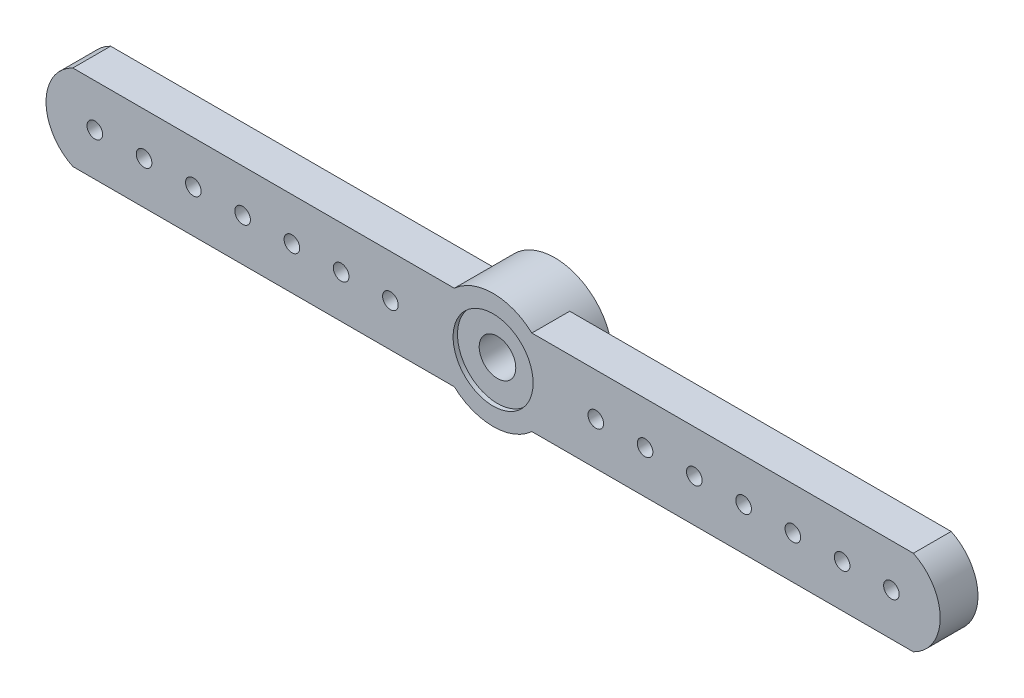
ISO-10303-21;
HEADER;
FILE_DESCRIPTION(('STEP AP214'),'2;1');
FILE_NAME('part.step','',(''),(''),'','','');
FILE_SCHEMA(('AUTOMOTIVE_DESIGN { 1 0 10303 214 1 1 1 1 }'));
ENDSEC;
DATA;
#1=APPLICATION_CONTEXT('core data for automotive mechanical design processes');
#2=APPLICATION_PROTOCOL_DEFINITION('international standard','automotive_design',2000,#1);
#3=PRODUCT_CONTEXT('',#1,'mechanical');
#4=PRODUCT('Part','Part','',(#3));
#5=PRODUCT_RELATED_PRODUCT_CATEGORY('part','',(#4));
#6=PRODUCT_DEFINITION_FORMATION('','',#4);
#7=PRODUCT_DEFINITION_CONTEXT('part definition',#1,'design');
#8=PRODUCT_DEFINITION('design','',#6,#7);
#9=PRODUCT_DEFINITION_SHAPE('','',#8);
#10=(LENGTH_UNIT() NAMED_UNIT(*) SI_UNIT(.MILLI.,.METRE.));
#11=(NAMED_UNIT(*) PLANE_ANGLE_UNIT() SI_UNIT($,.RADIAN.));
#12=(NAMED_UNIT(*) SI_UNIT($,.STERADIAN.) SOLID_ANGLE_UNIT());
#13=UNCERTAINTY_MEASURE_WITH_UNIT(LENGTH_MEASURE(1.E-05),#10,'distance_accuracy_value','');
#14=(GEOMETRIC_REPRESENTATION_CONTEXT(3) GLOBAL_UNCERTAINTY_ASSIGNED_CONTEXT((#13)) GLOBAL_UNIT_ASSIGNED_CONTEXT((#10,
#11,#12)) REPRESENTATION_CONTEXT('',''));
#15=CARTESIAN_POINT('',(0.,0.,0.));
#16=DIRECTION('',(0.,0.,1.));
#17=DIRECTION('',(1.,0.,0.));
#18=AXIS2_PLACEMENT_3D('',#15,#16,#17);
#19=CARTESIAN_POINT('',(0.,0.,0.));
#20=DIRECTION('',(0.,0.,1.));
#21=DIRECTION('',(1.,0.,0.));
#22=AXIS2_PLACEMENT_3D('',#19,#20,#21);
#23=PLANE('',#22);
#24=CARTESIAN_POINT('',(20.7391,0.,0.));
#25=DIRECTION('',(0.,0.,1.));
#26=DIRECTION('',(-1.,0.,0.));
#27=AXIS2_PLACEMENT_3D('',#24,#25,#26);
#28=CIRCLE('',#27,0.406400000000001);
#29=CARTESIAN_POINT('',(20.3327,0.,0.));
#30=VERTEX_POINT('',#29);
#31=EDGE_CURVE('E280',#30,#30,#28,.T.);
#32=ORIENTED_EDGE('',*,*,#31,.T.);
#33=EDGE_LOOP('',(#32));
#34=FACE_BOUND('',#33,.T.);
#35=CARTESIAN_POINT('',(18.1737,0.,0.));
#36=DIRECTION('',(0.,0.,1.));
#37=DIRECTION('',(-1.,0.,0.));
#38=AXIS2_PLACEMENT_3D('',#35,#36,#37);
#39=CIRCLE('',#38,0.406400000000001);
#40=CARTESIAN_POINT('',(17.7673,0.,0.));
#41=VERTEX_POINT('',#40);
#42=EDGE_CURVE('E274',#41,#41,#39,.T.);
#43=ORIENTED_EDGE('',*,*,#42,.T.);
#44=EDGE_LOOP('',(#43));
#45=FACE_BOUND('',#44,.T.);
#46=CARTESIAN_POINT('',(15.6083,0.,0.));
#47=DIRECTION('',(0.,0.,1.));
#48=DIRECTION('',(-1.,0.,0.));
#49=AXIS2_PLACEMENT_3D('',#46,#47,#48);
#50=CIRCLE('',#49,0.406400000000001);
#51=CARTESIAN_POINT('',(15.2019,0.,0.));
#52=VERTEX_POINT('',#51);
#53=EDGE_CURVE('E268',#52,#52,#50,.T.);
#54=ORIENTED_EDGE('',*,*,#53,.T.);
#55=EDGE_LOOP('',(#54));
#56=FACE_BOUND('',#55,.T.);
#57=CARTESIAN_POINT('',(13.0429,0.,0.));
#58=DIRECTION('',(0.,0.,1.));
#59=DIRECTION('',(-1.,0.,0.));
#60=AXIS2_PLACEMENT_3D('',#57,#58,#59);
#61=CIRCLE('',#60,0.406400000000001);
#62=CARTESIAN_POINT('',(12.6365,0.,0.));
#63=VERTEX_POINT('',#62);
#64=EDGE_CURVE('E262',#63,#63,#61,.T.);
#65=ORIENTED_EDGE('',*,*,#64,.T.);
#66=EDGE_LOOP('',(#65));
#67=FACE_BOUND('',#66,.T.);
#68=CARTESIAN_POINT('',(10.4775,0.,0.));
#69=DIRECTION('',(0.,0.,1.));
#70=DIRECTION('',(-1.,0.,0.));
#71=AXIS2_PLACEMENT_3D('',#68,#69,#70);
#72=CIRCLE('',#71,0.406400000000001);
#73=CARTESIAN_POINT('',(10.0711,0.,0.));
#74=VERTEX_POINT('',#73);
#75=EDGE_CURVE('E256',#74,#74,#72,.T.);
#76=ORIENTED_EDGE('',*,*,#75,.T.);
#77=EDGE_LOOP('',(#76));
#78=FACE_BOUND('',#77,.T.);
#79=CARTESIAN_POINT('',(7.9121,0.,0.));
#80=DIRECTION('',(0.,0.,1.));
#81=DIRECTION('',(-1.,0.,0.));
#82=AXIS2_PLACEMENT_3D('',#79,#80,#81);
#83=CIRCLE('',#82,0.406400000000001);
#84=CARTESIAN_POINT('',(7.5057,0.,0.));
#85=VERTEX_POINT('',#84);
#86=EDGE_CURVE('E250',#85,#85,#83,.T.);
#87=ORIENTED_EDGE('',*,*,#86,.T.);
#88=EDGE_LOOP('',(#87));
#89=FACE_BOUND('',#88,.T.);
#90=CARTESIAN_POINT('',(5.3467,0.,0.));
#91=DIRECTION('',(0.,0.,1.));
#92=DIRECTION('',(-1.,0.,0.));
#93=AXIS2_PLACEMENT_3D('',#90,#91,#92);
#94=CIRCLE('',#93,0.406400000000001);
#95=CARTESIAN_POINT('',(4.9403,0.,0.));
#96=VERTEX_POINT('',#95);
#97=EDGE_CURVE('E244',#96,#96,#94,.T.);
#98=ORIENTED_EDGE('',*,*,#97,.T.);
#99=EDGE_LOOP('',(#98));
#100=FACE_BOUND('',#99,.T.);
#101=CARTESIAN_POINT('',(0.,0.,0.));
#102=DIRECTION('',(0.,0.,-1.));
#103=DIRECTION('',(-1.,0.,0.));
#104=AXIS2_PLACEMENT_3D('',#101,#102,#103);
#105=CIRCLE('',#104,3.00355);
#106=CARTESIAN_POINT('',(2.02034807706494,2.2225,0.));
#107=VERTEX_POINT('',#106);
#108=CARTESIAN_POINT('',(2.02034807706494,-2.2225,0.));
#109=VERTEX_POINT('',#108);
#110=EDGE_CURVE('E11',#107,#109,#105,.T.);
#111=ORIENTED_EDGE('',*,*,#110,.F.);
#112=DIRECTION('',(1.,0.,0.));
#113=VECTOR('',#112,1.);
#114=CARTESIAN_POINT('',(0.,2.2225,0.));
#115=LINE('',#114,#113);
#116=CARTESIAN_POINT('',(21.8821,2.2225,0.));
#117=VERTEX_POINT('',#116);
#118=EDGE_CURVE('E139',#107,#117,#115,.T.);
#119=ORIENTED_EDGE('',*,*,#118,.T.);
#120=CARTESIAN_POINT('',(20.8127022727273,0.,0.));
#121=DIRECTION('',(0.,0.,1.));
#122=DIRECTION('',(1.,0.,0.));
#123=AXIS2_PLACEMENT_3D('',#120,#121,#122);
#124=CIRCLE('',#123,2.46639772727273);
#125=CARTESIAN_POINT('',(21.8821,-2.2225,0.));
#126=VERTEX_POINT('',#125);
#127=EDGE_CURVE('E136',#117,#126,#124,.F.);
#128=ORIENTED_EDGE('',*,*,#127,.T.);
#129=DIRECTION('',(1.,0.,0.));
#130=VECTOR('',#129,1.);
#131=CARTESIAN_POINT('',(0.,-2.2225,0.));
#132=LINE('',#131,#130);
#133=EDGE_CURVE('E140',#109,#126,#132,.T.);
#134=ORIENTED_EDGE('',*,*,#133,.F.);
#135=EDGE_LOOP('',(#111,#119,#128,#134));
#136=FACE_BOUND('',#135,.T.);
#137=ADVANCED_FACE('F34',(#34,#45,#56,#67,#78,#89,#100,#136),#23,.F.);
#138=CARTESIAN_POINT('',(-5.3467,0.,0.));
#139=DIRECTION('',(0.,0.,1.));
#140=DIRECTION('',(1.,0.,0.));
#141=AXIS2_PLACEMENT_3D('',#138,#139,#140);
#142=CIRCLE('',#141,0.406400000000001);
#143=CARTESIAN_POINT('',(-4.9403,0.,0.));
#144=VERTEX_POINT('',#143);
#145=EDGE_CURVE('E238',#144,#144,#142,.T.);
#146=ORIENTED_EDGE('',*,*,#145,.T.);
#147=EDGE_LOOP('',(#146));
#148=FACE_BOUND('',#147,.T.);
#149=CARTESIAN_POINT('',(-7.9121,0.,0.));
#150=DIRECTION('',(0.,0.,1.));
#151=DIRECTION('',(1.,0.,0.));
#152=AXIS2_PLACEMENT_3D('',#149,#150,#151);
#153=CIRCLE('',#152,0.406400000000001);
#154=CARTESIAN_POINT('',(-7.5057,0.,0.));
#155=VERTEX_POINT('',#154);
#156=EDGE_CURVE('E232',#155,#155,#153,.T.);
#157=ORIENTED_EDGE('',*,*,#156,.T.);
#158=EDGE_LOOP('',(#157));
#159=FACE_BOUND('',#158,.T.);
#160=CARTESIAN_POINT('',(-10.4775,0.,0.));
#161=DIRECTION('',(0.,0.,1.));
#162=DIRECTION('',(1.,0.,0.));
#163=AXIS2_PLACEMENT_3D('',#160,#161,#162);
#164=CIRCLE('',#163,0.406400000000001);
#165=CARTESIAN_POINT('',(-10.0711,0.,0.));
#166=VERTEX_POINT('',#165);
#167=EDGE_CURVE('E226',#166,#166,#164,.T.);
#168=ORIENTED_EDGE('',*,*,#167,.T.);
#169=EDGE_LOOP('',(#168));
#170=FACE_BOUND('',#169,.T.);
#171=CARTESIAN_POINT('',(-13.0429,0.,0.));
#172=DIRECTION('',(0.,0.,1.));
#173=DIRECTION('',(1.,0.,0.));
#174=AXIS2_PLACEMENT_3D('',#171,#172,#173);
#175=CIRCLE('',#174,0.406400000000001);
#176=CARTESIAN_POINT('',(-12.6365,0.,0.));
#177=VERTEX_POINT('',#176);
#178=EDGE_CURVE('E220',#177,#177,#175,.T.);
#179=ORIENTED_EDGE('',*,*,#178,.T.);
#180=EDGE_LOOP('',(#179));
#181=FACE_BOUND('',#180,.T.);
#182=CARTESIAN_POINT('',(-15.6083,0.,0.));
#183=DIRECTION('',(0.,0.,1.));
#184=DIRECTION('',(1.,0.,0.));
#185=AXIS2_PLACEMENT_3D('',#182,#183,#184);
#186=CIRCLE('',#185,0.406400000000001);
#187=CARTESIAN_POINT('',(-15.2019,0.,0.));
#188=VERTEX_POINT('',#187);
#189=EDGE_CURVE('E214',#188,#188,#186,.T.);
#190=ORIENTED_EDGE('',*,*,#189,.T.);
#191=EDGE_LOOP('',(#190));
#192=FACE_BOUND('',#191,.T.);
#193=CARTESIAN_POINT('',(-18.1737,0.,0.));
#194=DIRECTION('',(0.,0.,1.));
#195=DIRECTION('',(1.,0.,0.));
#196=AXIS2_PLACEMENT_3D('',#193,#194,#195);
#197=CIRCLE('',#196,0.406400000000001);
#198=CARTESIAN_POINT('',(-17.7673,0.,0.));
#199=VERTEX_POINT('',#198);
#200=EDGE_CURVE('E205',#199,#199,#197,.T.);
#201=ORIENTED_EDGE('',*,*,#200,.T.);
#202=EDGE_LOOP('',(#201));
#203=FACE_BOUND('',#202,.T.);
#204=CARTESIAN_POINT('',(-20.7391,0.,0.));
#205=DIRECTION('',(0.,0.,1.));
#206=DIRECTION('',(1.,0.,0.));
#207=AXIS2_PLACEMENT_3D('',#204,#205,#206);
#208=CIRCLE('',#207,0.406400000000001);
#209=CARTESIAN_POINT('',(-20.3327,0.,0.));
#210=VERTEX_POINT('',#209);
#211=EDGE_CURVE('E196',#210,#210,#208,.T.);
#212=ORIENTED_EDGE('',*,*,#211,.T.);
#213=EDGE_LOOP('',(#212));
#214=FACE_BOUND('',#213,.T.);
#215=CARTESIAN_POINT('',(-2.02034807706494,-2.2225,0.));
#216=VERTEX_POINT('',#215);
#217=CARTESIAN_POINT('',(-2.02034807706494,2.2225,0.));
#218=VERTEX_POINT('',#217);
#219=EDGE_CURVE('E44',#216,#218,#105,.T.);
#220=ORIENTED_EDGE('',*,*,#219,.F.);
#221=DIRECTION('',(1.,0.,0.));
#222=VECTOR('',#221,1.);
#223=CARTESIAN_POINT('',(0.,-2.2225,0.));
#224=LINE('',#223,#222);
#225=CARTESIAN_POINT('',(-21.8821,-2.2225,0.));
#226=VERTEX_POINT('',#225);
#227=EDGE_CURVE('E142',#226,#216,#224,.T.);
#228=ORIENTED_EDGE('',*,*,#227,.F.);
#229=CARTESIAN_POINT('',(-20.8127022727273,0.,0.));
#230=DIRECTION('',(0.,0.,1.));
#231=DIRECTION('',(1.,0.,0.));
#232=AXIS2_PLACEMENT_3D('',#229,#230,#231);
#233=CIRCLE('',#232,2.46639772727273);
#234=CARTESIAN_POINT('',(-21.8821,2.2225,0.));
#235=VERTEX_POINT('',#234);
#236=EDGE_CURVE('E79',#235,#226,#233,.T.);
#237=ORIENTED_EDGE('',*,*,#236,.F.);
#238=DIRECTION('',(1.,0.,0.));
#239=VECTOR('',#238,1.);
#240=CARTESIAN_POINT('',(0.,2.2225,0.));
#241=LINE('',#240,#239);
#242=EDGE_CURVE('E117',#235,#218,#241,.T.);
#243=ORIENTED_EDGE('',*,*,#242,.T.);
#244=EDGE_LOOP('',(#220,#228,#237,#243));
#245=FACE_BOUND('',#244,.T.);
#246=ADVANCED_FACE('F175',(#148,#159,#170,#181,#192,#203,#214,#245),#23,.F.);
#247=CARTESIAN_POINT('',(0.,-2.2225,1.9685));
#248=DIRECTION('',(0.,1.,0.));
#249=DIRECTION('',(0.,0.,1.));
#250=AXIS2_PLACEMENT_3D('',#247,#248,#249);
#251=PLANE('',#250);
#252=ORIENTED_EDGE('',*,*,#133,.T.);
#253=DIRECTION('',(0.,0.,-1.));
#254=VECTOR('',#253,1.);
#255=CARTESIAN_POINT('',(21.8821,-2.2225,1.9685));
#256=LINE('',#255,#254);
#257=CARTESIAN_POINT('',(21.8821,-2.2225,1.9685));
#258=VERTEX_POINT('',#257);
#259=EDGE_CURVE('E146',#258,#126,#256,.T.);
#260=ORIENTED_EDGE('',*,*,#259,.F.);
#261=DIRECTION('',(1.,0.,0.));
#262=VECTOR('',#261,1.);
#263=CARTESIAN_POINT('',(0.,-2.2225,1.9685));
#264=LINE('',#263,#262);
#265=CARTESIAN_POINT('',(2.02034807706494,-2.2225,1.9685));
#266=VERTEX_POINT('',#265);
#267=EDGE_CURVE('E95',#266,#258,#264,.T.);
#268=ORIENTED_EDGE('',*,*,#267,.F.);
#269=DIRECTION('',(0.,0.,-1.));
#270=VECTOR('',#269,1.);
#271=CARTESIAN_POINT('',(2.02034807706494,-2.2225,1.9685));
#272=LINE('',#271,#270);
#273=EDGE_CURVE('E149',#266,#109,#272,.T.);
#274=ORIENTED_EDGE('',*,*,#273,.T.);
#275=EDGE_LOOP('',(#252,#260,#268,#274));
#276=FACE_BOUND('',#275,.T.);
#277=ADVANCED_FACE('F36',(#276),#251,.F.);
#278=CARTESIAN_POINT('',(20.8127022727273,0.,1.9685));
#279=DIRECTION('',(0.,0.,-1.));
#280=DIRECTION('',(-1.,0.,0.));
#281=AXIS2_PLACEMENT_3D('',#278,#279,#280);
#282=CYLINDRICAL_SURFACE('',#281,2.46639772727273);
#283=ORIENTED_EDGE('',*,*,#127,.F.);
#284=DIRECTION('',(0.,0.,-1.));
#285=VECTOR('',#284,1.);
#286=CARTESIAN_POINT('',(21.8821,2.2225,1.9685));
#287=LINE('',#286,#285);
#288=CARTESIAN_POINT('',(21.8821,2.2225,1.9685));
#289=VERTEX_POINT('',#288);
#290=EDGE_CURVE('E144',#289,#117,#287,.T.);
#291=ORIENTED_EDGE('',*,*,#290,.F.);
#292=CARTESIAN_POINT('',(20.8127022727273,0.,1.9685));
#293=DIRECTION('',(0.,0.,1.));
#294=DIRECTION('',(1.,0.,0.));
#295=AXIS2_PLACEMENT_3D('',#292,#293,#294);
#296=CIRCLE('',#295,2.46639772727273);
#297=EDGE_CURVE('E195',#289,#258,#296,.F.);
#298=ORIENTED_EDGE('',*,*,#297,.T.);
#299=ORIENTED_EDGE('',*,*,#259,.T.);
#300=EDGE_LOOP('',(#283,#291,#298,#299));
#301=FACE_BOUND('',#300,.T.);
#302=ADVANCED_FACE('F193',(#301),#282,.T.);
#303=CARTESIAN_POINT('',(0.,2.2225,1.9685));
#304=DIRECTION('',(0.,1.,0.));
#305=DIRECTION('',(0.,0.,1.));
#306=AXIS2_PLACEMENT_3D('',#303,#304,#305);
#307=PLANE('',#306);
#308=ORIENTED_EDGE('',*,*,#118,.F.);
#309=DIRECTION('',(0.,0.,-1.));
#310=VECTOR('',#309,1.);
#311=CARTESIAN_POINT('',(2.02034807706494,2.2225,1.9685));
#312=LINE('',#311,#310);
#313=CARTESIAN_POINT('',(2.02034807706494,2.2225,1.9685));
#314=VERTEX_POINT('',#313);
#315=EDGE_CURVE('E147',#314,#107,#312,.T.);
#316=ORIENTED_EDGE('',*,*,#315,.F.);
#317=DIRECTION('',(1.,0.,0.));
#318=VECTOR('',#317,1.);
#319=CARTESIAN_POINT('',(0.,2.2225,1.9685));
#320=LINE('',#319,#318);
#321=EDGE_CURVE('E130',#314,#289,#320,.T.);
#322=ORIENTED_EDGE('',*,*,#321,.T.);
#323=ORIENTED_EDGE('',*,*,#290,.T.);
#324=EDGE_LOOP('',(#308,#316,#322,#323));
#325=FACE_BOUND('',#324,.T.);
#326=ADVANCED_FACE('F188',(#325),#307,.T.);
#327=CARTESIAN_POINT('',(0.,0.,1.9685));
#328=DIRECTION('',(0.,0.,-1.));
#329=DIRECTION('',(-1.,0.,0.));
#330=AXIS2_PLACEMENT_3D('',#327,#328,#329);
#331=CYLINDRICAL_SURFACE('',#330,3.00355);
#332=ORIENTED_EDGE('',*,*,#315,.T.);
#333=ORIENTED_EDGE('',*,*,#110,.T.);
#334=ORIENTED_EDGE('',*,*,#273,.F.);
#335=CARTESIAN_POINT('',(0.,0.,1.9685));
#336=DIRECTION('',(0.,0.,1.));
#337=DIRECTION('',(1.,0.,0.));
#338=AXIS2_PLACEMENT_3D('',#335,#336,#337);
#339=CIRCLE('',#338,3.00355);
#340=CARTESIAN_POINT('',(-2.02034807706494,-2.2225,1.9685));
#341=VERTEX_POINT('',#340);
#342=EDGE_CURVE('E162',#341,#266,#339,.T.);
#343=ORIENTED_EDGE('',*,*,#342,.F.);
#344=DIRECTION('',(0.,0.,-1.));
#345=VECTOR('',#344,1.);
#346=CARTESIAN_POINT('',(-2.02034807706494,-2.2225,1.9685));
#347=LINE('',#346,#345);
#348=EDGE_CURVE('E135',#341,#216,#347,.T.);
#349=ORIENTED_EDGE('',*,*,#348,.T.);
#350=ORIENTED_EDGE('',*,*,#219,.T.);
#351=DIRECTION('',(0.,0.,-1.));
#352=VECTOR('',#351,1.);
#353=CARTESIAN_POINT('',(-2.02034807706494,2.2225,1.9685));
#354=LINE('',#353,#352);
#355=CARTESIAN_POINT('',(-2.02034807706494,2.2225,1.9685));
#356=VERTEX_POINT('',#355);
#357=EDGE_CURVE('E118',#356,#218,#354,.T.);
#358=ORIENTED_EDGE('',*,*,#357,.F.);
#359=CARTESIAN_POINT('',(0.,0.,1.9685));
#360=DIRECTION('',(0.,0.,1.));
#361=DIRECTION('',(1.,0.,0.));
#362=AXIS2_PLACEMENT_3D('',#359,#360,#361);
#363=CIRCLE('',#362,3.00355);
#364=EDGE_CURVE('E127',#314,#356,#363,.T.);
#365=ORIENTED_EDGE('',*,*,#364,.F.);
#366=EDGE_LOOP('',(#332,#333,#334,#343,#349,#350,#358,#365));
#367=FACE_BOUND('',#366,.T.);
#368=CARTESIAN_POINT('',(0.,0.,-1.2446));
#369=DIRECTION('',(0.,0.,-1.));
#370=DIRECTION('',(-1.,0.,0.));
#371=AXIS2_PLACEMENT_3D('',#368,#369,#370);
#372=CIRCLE('',#371,3.00355);
#373=CARTESIAN_POINT('',(-3.00355,0.,-1.2446));
#374=VERTEX_POINT('',#373);
#375=EDGE_CURVE('E298',#374,#374,#372,.T.);
#376=ORIENTED_EDGE('',*,*,#375,.F.);
#377=EDGE_LOOP('',(#376));
#378=FACE_BOUND('',#377,.T.);
#379=ADVANCED_FACE('F170',(#367,#378),#331,.T.);
#380=CARTESIAN_POINT('',(0.,2.2225,1.9685));
#381=DIRECTION('',(0.,1.,0.));
#382=DIRECTION('',(0.,0.,1.));
#383=AXIS2_PLACEMENT_3D('',#380,#381,#382);
#384=PLANE('',#383);
#385=ORIENTED_EDGE('',*,*,#242,.F.);
#386=DIRECTION('',(0.,0.,-1.));
#387=VECTOR('',#386,1.);
#388=CARTESIAN_POINT('',(-21.8821,2.2225,1.9685));
#389=LINE('',#388,#387);
#390=CARTESIAN_POINT('',(-21.8821,2.2225,1.9685));
#391=VERTEX_POINT('',#390);
#392=EDGE_CURVE('E111',#391,#235,#389,.T.);
#393=ORIENTED_EDGE('',*,*,#392,.F.);
#394=DIRECTION('',(1.,0.,0.));
#395=VECTOR('',#394,1.);
#396=CARTESIAN_POINT('',(0.,2.2225,1.9685));
#397=LINE('',#396,#395);
#398=EDGE_CURVE('E116',#391,#356,#397,.T.);
#399=ORIENTED_EDGE('',*,*,#398,.T.);
#400=ORIENTED_EDGE('',*,*,#357,.T.);
#401=EDGE_LOOP('',(#385,#393,#399,#400));
#402=FACE_BOUND('',#401,.T.);
#403=ADVANCED_FACE('F113',(#402),#384,.T.);
#404=CARTESIAN_POINT('',(-20.8127022727273,0.,1.9685));
#405=DIRECTION('',(0.,0.,-1.));
#406=DIRECTION('',(-1.,0.,0.));
#407=AXIS2_PLACEMENT_3D('',#404,#405,#406);
#408=CYLINDRICAL_SURFACE('',#407,2.46639772727273);
#409=ORIENTED_EDGE('',*,*,#236,.T.);
#410=DIRECTION('',(0.,0.,-1.));
#411=VECTOR('',#410,1.);
#412=CARTESIAN_POINT('',(-21.8821,-2.2225,1.9685));
#413=LINE('',#412,#411);
#414=CARTESIAN_POINT('',(-21.8821,-2.2225,1.9685));
#415=VERTEX_POINT('',#414);
#416=EDGE_CURVE('E119',#415,#226,#413,.T.);
#417=ORIENTED_EDGE('',*,*,#416,.F.);
#418=CARTESIAN_POINT('',(-20.8127022727273,0.,1.9685));
#419=DIRECTION('',(0.,0.,1.));
#420=DIRECTION('',(1.,0.,0.));
#421=AXIS2_PLACEMENT_3D('',#418,#419,#420);
#422=CIRCLE('',#421,2.46639772727273);
#423=EDGE_CURVE('E121',#391,#415,#422,.T.);
#424=ORIENTED_EDGE('',*,*,#423,.F.);
#425=ORIENTED_EDGE('',*,*,#392,.T.);
#426=EDGE_LOOP('',(#409,#417,#424,#425));
#427=FACE_BOUND('',#426,.T.);
#428=ADVANCED_FACE('F122',(#427),#408,.T.);
#429=CARTESIAN_POINT('',(0.,-2.2225,1.9685));
#430=DIRECTION('',(0.,1.,0.));
#431=DIRECTION('',(0.,0.,1.));
#432=AXIS2_PLACEMENT_3D('',#429,#430,#431);
#433=PLANE('',#432);
#434=ORIENTED_EDGE('',*,*,#227,.T.);
#435=ORIENTED_EDGE('',*,*,#348,.F.);
#436=DIRECTION('',(1.,0.,0.));
#437=VECTOR('',#436,1.);
#438=CARTESIAN_POINT('',(0.,-2.2225,1.9685));
#439=LINE('',#438,#437);
#440=EDGE_CURVE('E53',#415,#341,#439,.T.);
#441=ORIENTED_EDGE('',*,*,#440,.F.);
#442=ORIENTED_EDGE('',*,*,#416,.T.);
#443=EDGE_LOOP('',(#434,#435,#441,#442));
#444=FACE_BOUND('',#443,.T.);
#445=ADVANCED_FACE('F174',(#444),#433,.F.);
#446=CARTESIAN_POINT('',(0.,0.,1.9685));
#447=DIRECTION('',(0.,0.,1.));
#448=DIRECTION('',(1.,0.,0.));
#449=AXIS2_PLACEMENT_3D('',#446,#447,#448);
#450=PLANE('',#449);
#451=CARTESIAN_POINT('',(0.,0.,1.9685));
#452=DIRECTION('',(0.,0.,1.));
#453=DIRECTION('',(1.,0.,0.));
#454=AXIS2_PLACEMENT_3D('',#451,#452,#453);
#455=CIRCLE('',#454,2.0828);
#456=CARTESIAN_POINT('',(2.0828,0.,1.9685));
#457=VERTEX_POINT('',#456);
#458=EDGE_CURVE('E289',#457,#457,#455,.T.);
#459=ORIENTED_EDGE('',*,*,#458,.F.);
#460=EDGE_LOOP('',(#459));
#461=FACE_BOUND('',#460,.T.);
#462=CARTESIAN_POINT('',(20.7391,0.,1.9685));
#463=DIRECTION('',(0.,0.,1.));
#464=DIRECTION('',(-1.,0.,0.));
#465=AXIS2_PLACEMENT_3D('',#462,#463,#464);
#466=CIRCLE('',#465,0.406400000000001);
#467=CARTESIAN_POINT('',(20.3327,0.,1.9685));
#468=VERTEX_POINT('',#467);
#469=EDGE_CURVE('E283',#468,#468,#466,.T.);
#470=ORIENTED_EDGE('',*,*,#469,.F.);
#471=EDGE_LOOP('',(#470));
#472=FACE_BOUND('',#471,.T.);
#473=CARTESIAN_POINT('',(18.1737,0.,1.9685));
#474=DIRECTION('',(0.,0.,1.));
#475=DIRECTION('',(-1.,0.,0.));
#476=AXIS2_PLACEMENT_3D('',#473,#474,#475);
#477=CIRCLE('',#476,0.406400000000001);
#478=CARTESIAN_POINT('',(17.7673,0.,1.9685));
#479=VERTEX_POINT('',#478);
#480=EDGE_CURVE('E277',#479,#479,#477,.T.);
#481=ORIENTED_EDGE('',*,*,#480,.F.);
#482=EDGE_LOOP('',(#481));
#483=FACE_BOUND('',#482,.T.);
#484=CARTESIAN_POINT('',(15.6083,0.,1.9685));
#485=DIRECTION('',(0.,0.,1.));
#486=DIRECTION('',(-1.,0.,0.));
#487=AXIS2_PLACEMENT_3D('',#484,#485,#486);
#488=CIRCLE('',#487,0.406400000000001);
#489=CARTESIAN_POINT('',(15.2019,0.,1.9685));
#490=VERTEX_POINT('',#489);
#491=EDGE_CURVE('E271',#490,#490,#488,.T.);
#492=ORIENTED_EDGE('',*,*,#491,.F.);
#493=EDGE_LOOP('',(#492));
#494=FACE_BOUND('',#493,.T.);
#495=CARTESIAN_POINT('',(13.0429,0.,1.9685));
#496=DIRECTION('',(0.,0.,1.));
#497=DIRECTION('',(-1.,0.,0.));
#498=AXIS2_PLACEMENT_3D('',#495,#496,#497);
#499=CIRCLE('',#498,0.406400000000001);
#500=CARTESIAN_POINT('',(12.6365,0.,1.9685));
#501=VERTEX_POINT('',#500);
#502=EDGE_CURVE('E265',#501,#501,#499,.T.);
#503=ORIENTED_EDGE('',*,*,#502,.F.);
#504=EDGE_LOOP('',(#503));
#505=FACE_BOUND('',#504,.T.);
#506=CARTESIAN_POINT('',(10.4775,0.,1.9685));
#507=DIRECTION('',(0.,0.,1.));
#508=DIRECTION('',(-1.,0.,0.));
#509=AXIS2_PLACEMENT_3D('',#506,#507,#508);
#510=CIRCLE('',#509,0.406400000000001);
#511=CARTESIAN_POINT('',(10.0711,0.,1.9685));
#512=VERTEX_POINT('',#511);
#513=EDGE_CURVE('E259',#512,#512,#510,.T.);
#514=ORIENTED_EDGE('',*,*,#513,.F.);
#515=EDGE_LOOP('',(#514));
#516=FACE_BOUND('',#515,.T.);
#517=CARTESIAN_POINT('',(7.9121,0.,1.9685));
#518=DIRECTION('',(0.,0.,1.));
#519=DIRECTION('',(-1.,0.,0.));
#520=AXIS2_PLACEMENT_3D('',#517,#518,#519);
#521=CIRCLE('',#520,0.406400000000001);
#522=CARTESIAN_POINT('',(7.5057,0.,1.9685));
#523=VERTEX_POINT('',#522);
#524=EDGE_CURVE('E253',#523,#523,#521,.T.);
#525=ORIENTED_EDGE('',*,*,#524,.F.);
#526=EDGE_LOOP('',(#525));
#527=FACE_BOUND('',#526,.T.);
#528=CARTESIAN_POINT('',(5.3467,0.,1.9685));
#529=DIRECTION('',(0.,0.,1.));
#530=DIRECTION('',(-1.,0.,0.));
#531=AXIS2_PLACEMENT_3D('',#528,#529,#530);
#532=CIRCLE('',#531,0.406400000000001);
#533=CARTESIAN_POINT('',(4.9403,0.,1.9685));
#534=VERTEX_POINT('',#533);
#535=EDGE_CURVE('E247',#534,#534,#532,.T.);
#536=ORIENTED_EDGE('',*,*,#535,.F.);
#537=EDGE_LOOP('',(#536));
#538=FACE_BOUND('',#537,.T.);
#539=CARTESIAN_POINT('',(-5.3467,0.,1.9685));
#540=DIRECTION('',(0.,0.,1.));
#541=DIRECTION('',(1.,0.,0.));
#542=AXIS2_PLACEMENT_3D('',#539,#540,#541);
#543=CIRCLE('',#542,0.406400000000001);
#544=CARTESIAN_POINT('',(-4.9403,0.,1.9685));
#545=VERTEX_POINT('',#544);
#546=EDGE_CURVE('E241',#545,#545,#543,.T.);
#547=ORIENTED_EDGE('',*,*,#546,.F.);
#548=EDGE_LOOP('',(#547));
#549=FACE_BOUND('',#548,.T.);
#550=CARTESIAN_POINT('',(-7.9121,0.,1.9685));
#551=DIRECTION('',(0.,0.,1.));
#552=DIRECTION('',(1.,0.,0.));
#553=AXIS2_PLACEMENT_3D('',#550,#551,#552);
#554=CIRCLE('',#553,0.406400000000001);
#555=CARTESIAN_POINT('',(-7.5057,0.,1.9685));
#556=VERTEX_POINT('',#555);
#557=EDGE_CURVE('E235',#556,#556,#554,.T.);
#558=ORIENTED_EDGE('',*,*,#557,.F.);
#559=EDGE_LOOP('',(#558));
#560=FACE_BOUND('',#559,.T.);
#561=CARTESIAN_POINT('',(-10.4775,0.,1.9685));
#562=DIRECTION('',(0.,0.,1.));
#563=DIRECTION('',(1.,0.,0.));
#564=AXIS2_PLACEMENT_3D('',#561,#562,#563);
#565=CIRCLE('',#564,0.406400000000001);
#566=CARTESIAN_POINT('',(-10.0711,0.,1.9685));
#567=VERTEX_POINT('',#566);
#568=EDGE_CURVE('E229',#567,#567,#565,.T.);
#569=ORIENTED_EDGE('',*,*,#568,.F.);
#570=EDGE_LOOP('',(#569));
#571=FACE_BOUND('',#570,.T.);
#572=CARTESIAN_POINT('',(-13.0429,0.,1.9685));
#573=DIRECTION('',(0.,0.,1.));
#574=DIRECTION('',(1.,0.,0.));
#575=AXIS2_PLACEMENT_3D('',#572,#573,#574);
#576=CIRCLE('',#575,0.406400000000001);
#577=CARTESIAN_POINT('',(-12.6365,0.,1.9685));
#578=VERTEX_POINT('',#577);
#579=EDGE_CURVE('E223',#578,#578,#576,.T.);
#580=ORIENTED_EDGE('',*,*,#579,.F.);
#581=EDGE_LOOP('',(#580));
#582=FACE_BOUND('',#581,.T.);
#583=CARTESIAN_POINT('',(-15.6083,0.,1.9685));
#584=DIRECTION('',(0.,0.,1.));
#585=DIRECTION('',(1.,0.,0.));
#586=AXIS2_PLACEMENT_3D('',#583,#584,#585);
#587=CIRCLE('',#586,0.406400000000001);
#588=CARTESIAN_POINT('',(-15.2019,0.,1.9685));
#589=VERTEX_POINT('',#588);
#590=EDGE_CURVE('E217',#589,#589,#587,.T.);
#591=ORIENTED_EDGE('',*,*,#590,.F.);
#592=EDGE_LOOP('',(#591));
#593=FACE_BOUND('',#592,.T.);
#594=CARTESIAN_POINT('',(-18.1737,0.,1.9685));
#595=DIRECTION('',(0.,0.,1.));
#596=DIRECTION('',(1.,0.,0.));
#597=AXIS2_PLACEMENT_3D('',#594,#595,#596);
#598=CIRCLE('',#597,0.406400000000001);
#599=CARTESIAN_POINT('',(-17.7673,0.,1.9685));
#600=VERTEX_POINT('',#599);
#601=EDGE_CURVE('E208',#600,#600,#598,.T.);
#602=ORIENTED_EDGE('',*,*,#601,.F.);
#603=EDGE_LOOP('',(#602));
#604=FACE_BOUND('',#603,.T.);
#605=CARTESIAN_POINT('',(-20.7391,0.,1.9685));
#606=DIRECTION('',(0.,0.,1.));
#607=DIRECTION('',(1.,0.,0.));
#608=AXIS2_PLACEMENT_3D('',#605,#606,#607);
#609=CIRCLE('',#608,0.406400000000001);
#610=CARTESIAN_POINT('',(-20.3327,0.,1.9685));
#611=VERTEX_POINT('',#610);
#612=EDGE_CURVE('E198',#611,#611,#609,.T.);
#613=ORIENTED_EDGE('',*,*,#612,.F.);
#614=EDGE_LOOP('',(#613));
#615=FACE_BOUND('',#614,.T.);
#616=ORIENTED_EDGE('',*,*,#342,.T.);
#617=ORIENTED_EDGE('',*,*,#267,.T.);
#618=ORIENTED_EDGE('',*,*,#297,.F.);
#619=ORIENTED_EDGE('',*,*,#321,.F.);
#620=ORIENTED_EDGE('',*,*,#364,.T.);
#621=ORIENTED_EDGE('',*,*,#398,.F.);
#622=ORIENTED_EDGE('',*,*,#423,.T.);
#623=ORIENTED_EDGE('',*,*,#440,.T.);
#624=EDGE_LOOP('',(#616,#617,#618,#619,#620,#621,#622,#623));
#625=FACE_BOUND('',#624,.T.);
#626=ADVANCED_FACE('F124',(#461,#472,#483,#494,#505,#516,#527,#538,#549,#560,#571,#582,#593,
#604,#615,#625),#450,.T.);
#627=CARTESIAN_POINT('',(0.,0.,0.));
#628=DIRECTION('',(0.,0.,-1.));
#629=DIRECTION('',(-1.,0.,0.));
#630=AXIS2_PLACEMENT_3D('',#627,#628,#629);
#631=CIRCLE('',#630,1.73355);
#632=CARTESIAN_POINT('',(-1.73355,0.,0.));
#633=VERTEX_POINT('',#632);
#634=EDGE_CURVE('E304',#633,#633,#631,.T.);
#635=ORIENTED_EDGE('',*,*,#634,.T.);
#636=EDGE_LOOP('',(#635));
#637=FACE_BOUND('',#636,.T.);
#638=CARTESIAN_POINT('',(0.,0.,0.));
#639=DIRECTION('',(0.,0.,1.));
#640=DIRECTION('',(1.,0.,0.));
#641=AXIS2_PLACEMENT_3D('',#638,#639,#640);
#642=CIRCLE('',#641,0.9525);
#643=CARTESIAN_POINT('',(0.9525,0.,0.));
#644=VERTEX_POINT('',#643);
#645=EDGE_CURVE('E292',#644,#644,#642,.T.);
#646=ORIENTED_EDGE('',*,*,#645,.T.);
#647=EDGE_LOOP('',(#646));
#648=FACE_BOUND('',#647,.T.);
#649=ADVANCED_FACE('F329',(#637,#648),#23,.F.);
#650=CARTESIAN_POINT('',(-20.7391,0.,0.));
#651=DIRECTION('',(0.,0.,1.));
#652=DIRECTION('',(1.,0.,0.));
#653=AXIS2_PLACEMENT_3D('',#650,#651,#652);
#654=CYLINDRICAL_SURFACE('',#653,0.406400000000001);
#655=ORIENTED_EDGE('',*,*,#211,.F.);
#656=EDGE_LOOP('',(#655));
#657=FACE_BOUND('',#656,.T.);
#658=ORIENTED_EDGE('',*,*,#612,.T.);
#659=EDGE_LOOP('',(#658));
#660=FACE_BOUND('',#659,.T.);
#661=ADVANCED_FACE('F338',(#657,#660),#654,.F.);
#662=CARTESIAN_POINT('',(-18.1737,0.,0.));
#663=DIRECTION('',(0.,0.,1.));
#664=DIRECTION('',(1.,0.,0.));
#665=AXIS2_PLACEMENT_3D('',#662,#663,#664);
#666=CYLINDRICAL_SURFACE('',#665,0.406400000000001);
#667=ORIENTED_EDGE('',*,*,#200,.F.);
#668=EDGE_LOOP('',(#667));
#669=FACE_BOUND('',#668,.T.);
#670=ORIENTED_EDGE('',*,*,#601,.T.);
#671=EDGE_LOOP('',(#670));
#672=FACE_BOUND('',#671,.T.);
#673=ADVANCED_FACE('F344',(#669,#672),#666,.F.);
#674=CARTESIAN_POINT('',(-15.6083,0.,0.));
#675=DIRECTION('',(0.,0.,1.));
#676=DIRECTION('',(1.,0.,0.));
#677=AXIS2_PLACEMENT_3D('',#674,#675,#676);
#678=CYLINDRICAL_SURFACE('',#677,0.406400000000001);
#679=ORIENTED_EDGE('',*,*,#189,.F.);
#680=EDGE_LOOP('',(#679));
#681=FACE_BOUND('',#680,.T.);
#682=ORIENTED_EDGE('',*,*,#590,.T.);
#683=EDGE_LOOP('',(#682));
#684=FACE_BOUND('',#683,.T.);
#685=ADVANCED_FACE('F396',(#681,#684),#678,.F.);
#686=CARTESIAN_POINT('',(-13.0429,0.,0.));
#687=DIRECTION('',(0.,0.,1.));
#688=DIRECTION('',(1.,0.,0.));
#689=AXIS2_PLACEMENT_3D('',#686,#687,#688);
#690=CYLINDRICAL_SURFACE('',#689,0.406400000000001);
#691=ORIENTED_EDGE('',*,*,#178,.F.);
#692=EDGE_LOOP('',(#691));
#693=FACE_BOUND('',#692,.T.);
#694=ORIENTED_EDGE('',*,*,#579,.T.);
#695=EDGE_LOOP('',(#694));
#696=FACE_BOUND('',#695,.T.);
#697=ADVANCED_FACE('F402',(#693,#696),#690,.F.);
#698=CARTESIAN_POINT('',(-10.4775,0.,0.));
#699=DIRECTION('',(0.,0.,1.));
#700=DIRECTION('',(1.,0.,0.));
#701=AXIS2_PLACEMENT_3D('',#698,#699,#700);
#702=CYLINDRICAL_SURFACE('',#701,0.406400000000001);
#703=ORIENTED_EDGE('',*,*,#167,.F.);
#704=EDGE_LOOP('',(#703));
#705=FACE_BOUND('',#704,.T.);
#706=ORIENTED_EDGE('',*,*,#568,.T.);
#707=EDGE_LOOP('',(#706));
#708=FACE_BOUND('',#707,.T.);
#709=ADVANCED_FACE('F409',(#705,#708),#702,.F.);
#710=CARTESIAN_POINT('',(-7.9121,0.,0.));
#711=DIRECTION('',(0.,0.,1.));
#712=DIRECTION('',(1.,0.,0.));
#713=AXIS2_PLACEMENT_3D('',#710,#711,#712);
#714=CYLINDRICAL_SURFACE('',#713,0.406400000000001);
#715=ORIENTED_EDGE('',*,*,#156,.F.);
#716=EDGE_LOOP('',(#715));
#717=FACE_BOUND('',#716,.T.);
#718=ORIENTED_EDGE('',*,*,#557,.T.);
#719=EDGE_LOOP('',(#718));
#720=FACE_BOUND('',#719,.T.);
#721=ADVANCED_FACE('F413',(#717,#720),#714,.F.);
#722=CARTESIAN_POINT('',(-5.3467,0.,0.));
#723=DIRECTION('',(0.,0.,1.));
#724=DIRECTION('',(1.,0.,0.));
#725=AXIS2_PLACEMENT_3D('',#722,#723,#724);
#726=CYLINDRICAL_SURFACE('',#725,0.406400000000001);
#727=ORIENTED_EDGE('',*,*,#145,.F.);
#728=EDGE_LOOP('',(#727));
#729=FACE_BOUND('',#728,.T.);
#730=ORIENTED_EDGE('',*,*,#546,.T.);
#731=EDGE_LOOP('',(#730));
#732=FACE_BOUND('',#731,.T.);
#733=ADVANCED_FACE('F417',(#729,#732),#726,.F.);
#734=CARTESIAN_POINT('',(5.3467,0.,0.));
#735=DIRECTION('',(0.,0.,1.));
#736=DIRECTION('',(1.,0.,0.));
#737=AXIS2_PLACEMENT_3D('',#734,#735,#736);
#738=CYLINDRICAL_SURFACE('',#737,0.406400000000001);
#739=ORIENTED_EDGE('',*,*,#97,.F.);
#740=EDGE_LOOP('',(#739));
#741=FACE_BOUND('',#740,.T.);
#742=ORIENTED_EDGE('',*,*,#535,.T.);
#743=EDGE_LOOP('',(#742));
#744=FACE_BOUND('',#743,.T.);
#745=ADVANCED_FACE('F421',(#741,#744),#738,.F.);
#746=CARTESIAN_POINT('',(7.9121,0.,0.));
#747=DIRECTION('',(0.,0.,1.));
#748=DIRECTION('',(1.,0.,0.));
#749=AXIS2_PLACEMENT_3D('',#746,#747,#748);
#750=CYLINDRICAL_SURFACE('',#749,0.406400000000001);
#751=ORIENTED_EDGE('',*,*,#86,.F.);
#752=EDGE_LOOP('',(#751));
#753=FACE_BOUND('',#752,.T.);
#754=ORIENTED_EDGE('',*,*,#524,.T.);
#755=EDGE_LOOP('',(#754));
#756=FACE_BOUND('',#755,.T.);
#757=ADVANCED_FACE('F425',(#753,#756),#750,.F.);
#758=CARTESIAN_POINT('',(10.4775,0.,0.));
#759=DIRECTION('',(0.,0.,1.));
#760=DIRECTION('',(1.,0.,0.));
#761=AXIS2_PLACEMENT_3D('',#758,#759,#760);
#762=CYLINDRICAL_SURFACE('',#761,0.406400000000001);
#763=ORIENTED_EDGE('',*,*,#75,.F.);
#764=EDGE_LOOP('',(#763));
#765=FACE_BOUND('',#764,.T.);
#766=ORIENTED_EDGE('',*,*,#513,.T.);
#767=EDGE_LOOP('',(#766));
#768=FACE_BOUND('',#767,.T.);
#769=ADVANCED_FACE('F429',(#765,#768),#762,.F.);
#770=CARTESIAN_POINT('',(13.0429,0.,0.));
#771=DIRECTION('',(0.,0.,1.));
#772=DIRECTION('',(1.,0.,0.));
#773=AXIS2_PLACEMENT_3D('',#770,#771,#772);
#774=CYLINDRICAL_SURFACE('',#773,0.406400000000001);
#775=ORIENTED_EDGE('',*,*,#64,.F.);
#776=EDGE_LOOP('',(#775));
#777=FACE_BOUND('',#776,.T.);
#778=ORIENTED_EDGE('',*,*,#502,.T.);
#779=EDGE_LOOP('',(#778));
#780=FACE_BOUND('',#779,.T.);
#781=ADVANCED_FACE('F433',(#777,#780),#774,.F.);
#782=CARTESIAN_POINT('',(15.6083,0.,0.));
#783=DIRECTION('',(0.,0.,1.));
#784=DIRECTION('',(1.,0.,0.));
#785=AXIS2_PLACEMENT_3D('',#782,#783,#784);
#786=CYLINDRICAL_SURFACE('',#785,0.406400000000001);
#787=ORIENTED_EDGE('',*,*,#53,.F.);
#788=EDGE_LOOP('',(#787));
#789=FACE_BOUND('',#788,.T.);
#790=ORIENTED_EDGE('',*,*,#491,.T.);
#791=EDGE_LOOP('',(#790));
#792=FACE_BOUND('',#791,.T.);
#793=ADVANCED_FACE('F437',(#789,#792),#786,.F.);
#794=CARTESIAN_POINT('',(18.1737,0.,0.));
#795=DIRECTION('',(0.,0.,1.));
#796=DIRECTION('',(1.,0.,0.));
#797=AXIS2_PLACEMENT_3D('',#794,#795,#796);
#798=CYLINDRICAL_SURFACE('',#797,0.406400000000001);
#799=ORIENTED_EDGE('',*,*,#42,.F.);
#800=EDGE_LOOP('',(#799));
#801=FACE_BOUND('',#800,.T.);
#802=ORIENTED_EDGE('',*,*,#480,.T.);
#803=EDGE_LOOP('',(#802));
#804=FACE_BOUND('',#803,.T.);
#805=ADVANCED_FACE('F441',(#801,#804),#798,.F.);
#806=CARTESIAN_POINT('',(20.7391,0.,0.));
#807=DIRECTION('',(0.,0.,1.));
#808=DIRECTION('',(1.,0.,0.));
#809=AXIS2_PLACEMENT_3D('',#806,#807,#808);
#810=CYLINDRICAL_SURFACE('',#809,0.406400000000001);
#811=ORIENTED_EDGE('',*,*,#31,.F.);
#812=EDGE_LOOP('',(#811));
#813=FACE_BOUND('',#812,.T.);
#814=ORIENTED_EDGE('',*,*,#469,.T.);
#815=EDGE_LOOP('',(#814));
#816=FACE_BOUND('',#815,.T.);
#817=ADVANCED_FACE('F362',(#813,#816),#810,.F.);
#818=CARTESIAN_POINT('',(0.,0.,1.7399));
#819=DIRECTION('',(0.,0.,1.));
#820=DIRECTION('',(1.,0.,0.));
#821=AXIS2_PLACEMENT_3D('',#818,#819,#820);
#822=CYLINDRICAL_SURFACE('',#821,2.0828);
#823=CARTESIAN_POINT('',(0.,0.,1.7399));
#824=DIRECTION('',(0.,0.,1.));
#825=DIRECTION('',(1.,0.,0.));
#826=AXIS2_PLACEMENT_3D('',#823,#824,#825);
#827=CIRCLE('',#826,2.0828);
#828=CARTESIAN_POINT('',(2.0828,0.,1.7399));
#829=VERTEX_POINT('',#828);
#830=EDGE_CURVE('E286',#829,#829,#827,.T.);
#831=ORIENTED_EDGE('',*,*,#830,.F.);
#832=EDGE_LOOP('',(#831));
#833=FACE_BOUND('',#832,.T.);
#834=ORIENTED_EDGE('',*,*,#458,.T.);
#835=EDGE_LOOP('',(#834));
#836=FACE_BOUND('',#835,.T.);
#837=ADVANCED_FACE('F356',(#833,#836),#822,.F.);
#838=CARTESIAN_POINT('',(0.,0.,1.7399));
#839=DIRECTION('',(0.,0.,1.));
#840=DIRECTION('',(1.,0.,0.));
#841=AXIS2_PLACEMENT_3D('',#838,#839,#840);
#842=PLANE('',#841);
#843=CARTESIAN_POINT('',(0.,0.,1.7399));
#844=DIRECTION('',(0.,0.,1.));
#845=DIRECTION('',(1.,0.,0.));
#846=AXIS2_PLACEMENT_3D('',#843,#844,#845);
#847=CIRCLE('',#846,0.9525);
#848=CARTESIAN_POINT('',(0.9525,0.,1.7399));
#849=VERTEX_POINT('',#848);
#850=EDGE_CURVE('E295',#849,#849,#847,.T.);
#851=ORIENTED_EDGE('',*,*,#850,.F.);
#852=EDGE_LOOP('',(#851));
#853=FACE_BOUND('',#852,.T.);
#854=ORIENTED_EDGE('',*,*,#830,.T.);
#855=EDGE_LOOP('',(#854));
#856=FACE_BOUND('',#855,.T.);
#857=ADVANCED_FACE('F323',(#853,#856),#842,.T.);
#858=CARTESIAN_POINT('',(0.,0.,0.));
#859=DIRECTION('',(0.,0.,1.));
#860=DIRECTION('',(1.,0.,0.));
#861=AXIS2_PLACEMENT_3D('',#858,#859,#860);
#862=CYLINDRICAL_SURFACE('',#861,0.9525);
#863=ORIENTED_EDGE('',*,*,#645,.F.);
#864=EDGE_LOOP('',(#863));
#865=FACE_BOUND('',#864,.T.);
#866=ORIENTED_EDGE('',*,*,#850,.T.);
#867=EDGE_LOOP('',(#866));
#868=FACE_BOUND('',#867,.T.);
#869=ADVANCED_FACE('F315',(#865,#868),#862,.F.);
#870=CARTESIAN_POINT('',(0.,0.,-1.2446));
#871=DIRECTION('',(0.,0.,-1.));
#872=DIRECTION('',(-1.,0.,0.));
#873=AXIS2_PLACEMENT_3D('',#870,#871,#872);
#874=PLANE('',#873);
#875=ORIENTED_EDGE('',*,*,#375,.T.);
#876=EDGE_LOOP('',(#875));
#877=FACE_BOUND('',#876,.T.);
#878=CARTESIAN_POINT('',(0.,0.,-1.2446));
#879=DIRECTION('',(0.,0.,-1.));
#880=DIRECTION('',(-1.,0.,0.));
#881=AXIS2_PLACEMENT_3D('',#878,#879,#880);
#882=CIRCLE('',#881,1.73355);
#883=CARTESIAN_POINT('',(-1.73355,0.,-1.2446));
#884=VERTEX_POINT('',#883);
#885=EDGE_CURVE('E303',#884,#884,#882,.T.);
#886=ORIENTED_EDGE('',*,*,#885,.F.);
#887=EDGE_LOOP('',(#886));
#888=FACE_BOUND('',#887,.T.);
#889=ADVANCED_FACE('F313',(#877,#888),#874,.T.);
#890=CARTESIAN_POINT('',(0.,0.,-1.2446));
#891=DIRECTION('',(0.,0.,1.));
#892=DIRECTION('',(1.,0.,0.));
#893=AXIS2_PLACEMENT_3D('',#890,#891,#892);
#894=CYLINDRICAL_SURFACE('',#893,1.73355);
#895=ORIENTED_EDGE('',*,*,#885,.T.);
#896=EDGE_LOOP('',(#895));
#897=FACE_BOUND('',#896,.T.);
#898=ORIENTED_EDGE('',*,*,#634,.F.);
#899=EDGE_LOOP('',(#898));
#900=FACE_BOUND('',#899,.T.);
#901=ADVANCED_FACE('F310',(#897,#900),#894,.F.);
#902=CLOSED_SHELL('',(#137,#246,#277,#302,#326,#379,#403,#428,#445,#626,#649,#661,#673,#685,
#697,#709,#721,#733,#745,#757,#769,#781,#793,#805,#817,#837,#857,#869,#889,#901));
#903=MANIFOLD_SOLID_BREP('B2',#902);
#904=ADVANCED_BREP_SHAPE_REPRESENTATION('',(#18,#903),#14);
#905=SHAPE_DEFINITION_REPRESENTATION(#9,#904);
ENDSEC;
END-ISO-10303-21;
